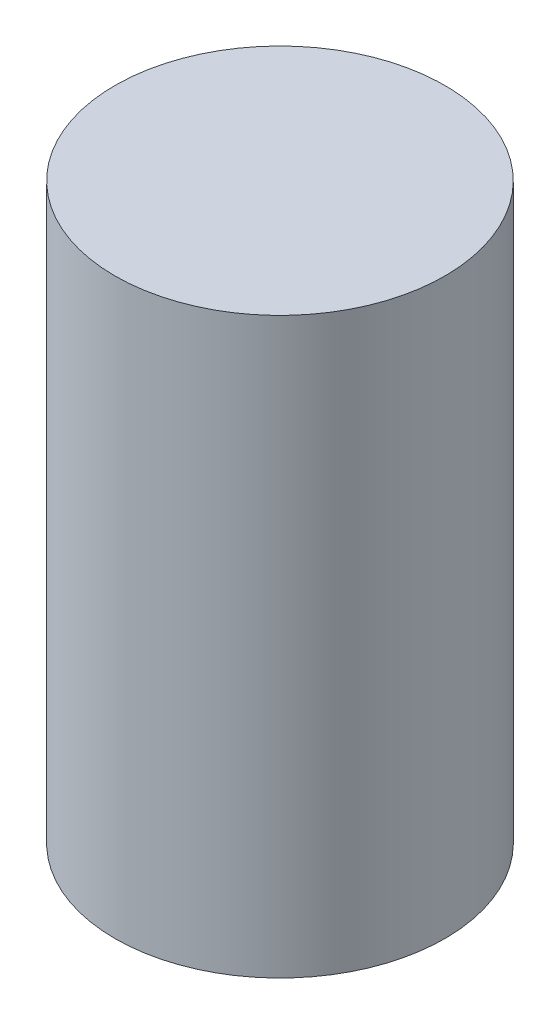
ISO-10303-21;
HEADER;
FILE_DESCRIPTION(('STEP AP214'),'2;1');
FILE_NAME('part.step','',(''),(''),'','','');
FILE_SCHEMA(('AUTOMOTIVE_DESIGN { 1 0 10303 214 1 1 1 1 }'));
ENDSEC;
DATA;
#1=APPLICATION_CONTEXT('core data for automotive mechanical design processes');
#2=APPLICATION_PROTOCOL_DEFINITION('international standard','automotive_design',2000,#1);
#3=PRODUCT_CONTEXT('',#1,'mechanical');
#4=PRODUCT('Part','Part','',(#3));
#5=PRODUCT_RELATED_PRODUCT_CATEGORY('part','',(#4));
#6=PRODUCT_DEFINITION_FORMATION('','',#4);
#7=PRODUCT_DEFINITION_CONTEXT('part definition',#1,'design');
#8=PRODUCT_DEFINITION('design','',#6,#7);
#9=PRODUCT_DEFINITION_SHAPE('','',#8);
#10=(LENGTH_UNIT() NAMED_UNIT(*) SI_UNIT(.MILLI.,.METRE.));
#11=(NAMED_UNIT(*) PLANE_ANGLE_UNIT() SI_UNIT($,.RADIAN.));
#12=(NAMED_UNIT(*) SI_UNIT($,.STERADIAN.) SOLID_ANGLE_UNIT());
#13=UNCERTAINTY_MEASURE_WITH_UNIT(LENGTH_MEASURE(1.E-05),#10,'distance_accuracy_value','');
#14=(GEOMETRIC_REPRESENTATION_CONTEXT(3) GLOBAL_UNCERTAINTY_ASSIGNED_CONTEXT((#13)) GLOBAL_UNIT_ASSIGNED_CONTEXT((#10,
#11,#12)) REPRESENTATION_CONTEXT('',''));
#15=CARTESIAN_POINT('',(0.,0.,0.));
#16=DIRECTION('',(0.,0.,1.));
#17=DIRECTION('',(1.,0.,0.));
#18=AXIS2_PLACEMENT_3D('',#15,#16,#17);
#19=CARTESIAN_POINT('',(0.,24.,0.));
#20=DIRECTION('',(0.,-1.,0.));
#21=DIRECTION('',(0.,0.,-1.));
#22=AXIS2_PLACEMENT_3D('',#19,#20,#21);
#23=CYLINDRICAL_SURFACE('',#22,6.9);
#24=CARTESIAN_POINT('',(0.,24.,0.));
#25=DIRECTION('',(0.,1.,0.));
#26=DIRECTION('',(0.,0.,1.));
#27=AXIS2_PLACEMENT_3D('',#24,#25,#26);
#28=CIRCLE('',#27,6.9);
#29=CARTESIAN_POINT('',(0.,24.,6.9));
#30=VERTEX_POINT('',#29);
#31=EDGE_CURVE('E10',#30,#30,#28,.T.);
#32=ORIENTED_EDGE('',*,*,#31,.F.);
#33=EDGE_LOOP('',(#32));
#34=FACE_BOUND('',#33,.T.);
#35=CARTESIAN_POINT('',(0.,0.,0.));
#36=DIRECTION('',(0.,1.,0.));
#37=DIRECTION('',(0.,0.,1.));
#38=AXIS2_PLACEMENT_3D('',#35,#36,#37);
#39=CIRCLE('',#38,6.9);
#40=CARTESIAN_POINT('',(0.,0.,6.9));
#41=VERTEX_POINT('',#40);
#42=EDGE_CURVE('E34',#41,#41,#39,.T.);
#43=ORIENTED_EDGE('',*,*,#42,.T.);
#44=EDGE_LOOP('',(#43));
#45=FACE_BOUND('',#44,.T.);
#46=ADVANCED_FACE('F31',(#34,#45),#23,.T.);
#47=CARTESIAN_POINT('',(0.,24.,0.));
#48=DIRECTION('',(0.,1.,0.));
#49=DIRECTION('',(0.,0.,1.));
#50=AXIS2_PLACEMENT_3D('',#47,#48,#49);
#51=PLANE('',#50);
#52=ORIENTED_EDGE('',*,*,#31,.T.);
#53=EDGE_LOOP('',(#52));
#54=FACE_BOUND('',#53,.T.);
#55=ADVANCED_FACE('F46',(#54),#51,.T.);
#56=CARTESIAN_POINT('',(0.,0.,0.));
#57=DIRECTION('',(0.,1.,0.));
#58=DIRECTION('',(0.,0.,1.));
#59=AXIS2_PLACEMENT_3D('',#56,#57,#58);
#60=PLANE('',#59);
#61=ORIENTED_EDGE('',*,*,#42,.F.);
#62=EDGE_LOOP('',(#61));
#63=FACE_BOUND('',#62,.T.);
#64=ADVANCED_FACE('F44',(#63),#60,.F.);
#65=CLOSED_SHELL('',(#46,#55,#64));
#66=MANIFOLD_SOLID_BREP('B2',#65);
#67=ADVANCED_BREP_SHAPE_REPRESENTATION('',(#18,#66),#14);
#68=SHAPE_DEFINITION_REPRESENTATION(#9,#67);
ENDSEC;
END-ISO-10303-21;
